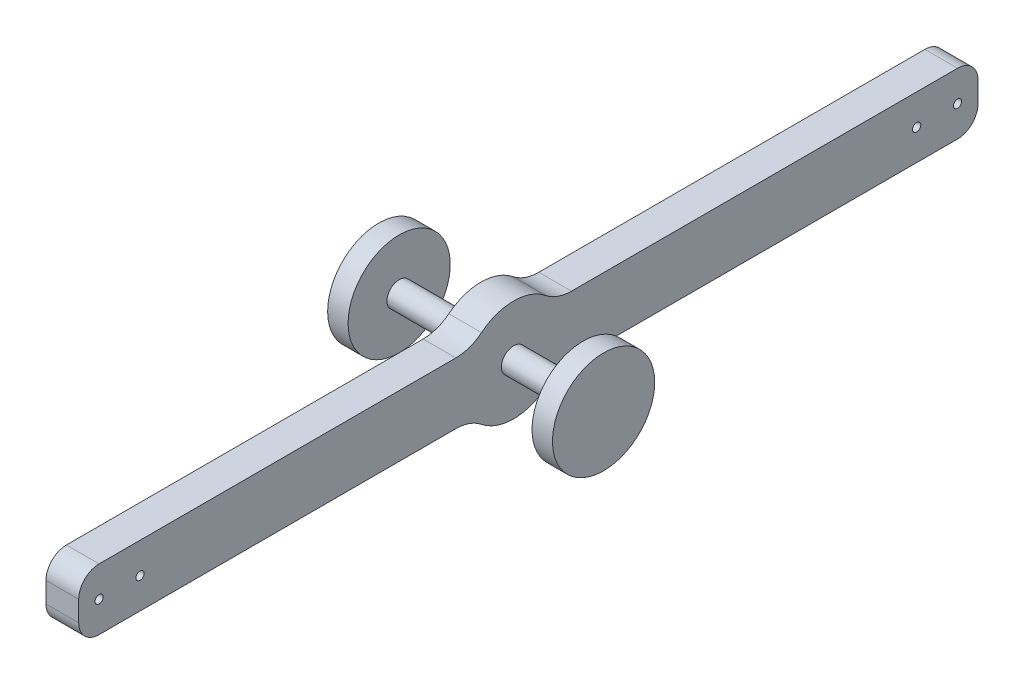
ISO-10303-21;
HEADER;
FILE_DESCRIPTION(('STEP AP214'),'2;1');
FILE_NAME('part.step','',(''),(''),'','','');
FILE_SCHEMA(('AUTOMOTIVE_DESIGN { 1 0 10303 214 1 1 1 1 }'));
ENDSEC;
DATA;
#1=APPLICATION_CONTEXT('core data for automotive mechanical design processes');
#2=APPLICATION_PROTOCOL_DEFINITION('international standard','automotive_design',2000,#1);
#3=PRODUCT_CONTEXT('',#1,'mechanical');
#4=PRODUCT('Part','Part','',(#3));
#5=PRODUCT_RELATED_PRODUCT_CATEGORY('part','',(#4));
#6=PRODUCT_DEFINITION_FORMATION('','',#4);
#7=PRODUCT_DEFINITION_CONTEXT('part definition',#1,'design');
#8=PRODUCT_DEFINITION('design','',#6,#7);
#9=PRODUCT_DEFINITION_SHAPE('','',#8);
#10=(LENGTH_UNIT() NAMED_UNIT(*) SI_UNIT(.MILLI.,.METRE.));
#11=(NAMED_UNIT(*) PLANE_ANGLE_UNIT() SI_UNIT($,.RADIAN.));
#12=(NAMED_UNIT(*) SI_UNIT($,.STERADIAN.) SOLID_ANGLE_UNIT());
#13=UNCERTAINTY_MEASURE_WITH_UNIT(LENGTH_MEASURE(1.E-05),#10,'distance_accuracy_value','');
#14=(GEOMETRIC_REPRESENTATION_CONTEXT(3) GLOBAL_UNCERTAINTY_ASSIGNED_CONTEXT((#13)) GLOBAL_UNIT_ASSIGNED_CONTEXT((#10,
#11,#12)) REPRESENTATION_CONTEXT('',''));
#15=CARTESIAN_POINT('',(0.,0.,0.));
#16=DIRECTION('',(0.,0.,1.));
#17=DIRECTION('',(1.,0.,0.));
#18=AXIS2_PLACEMENT_3D('',#15,#16,#17);
#19=CARTESIAN_POINT('',(-35.3553390593274,7.5,-6.4));
#20=DIRECTION('',(1.,0.,0.));
#21=DIRECTION('',(0.,0.,-1.));
#22=AXIS2_PLACEMENT_3D('',#19,#20,#21);
#23=CYLINDRICAL_SURFACE('',#22,12.5);
#24=CARTESIAN_POINT('',(0.,7.5,-6.4));
#25=DIRECTION('',(-1.,0.,0.));
#26=DIRECTION('',(0.,0.,1.));
#27=AXIS2_PLACEMENT_3D('',#24,#25,#26);
#28=CIRCLE('',#27,12.5);
#29=CARTESIAN_POINT('',(0.,-2.22222222222222,1.45674201318386));
#30=VERTEX_POINT('',#29);
#31=CARTESIAN_POINT('',(0.,-2.22222222222222,-14.2567420131839));
#32=VERTEX_POINT('',#31);
#33=EDGE_CURVE('E289',#30,#32,#28,.F.);
#34=ORIENTED_EDGE('',*,*,#33,.T.);
#35=DIRECTION('',(1.,0.,0.));
#36=VECTOR('',#35,1.);
#37=CARTESIAN_POINT('',(-35.3553390593274,-2.22222222222222,-14.2567420131839));
#38=LINE('',#37,#36);
#39=CARTESIAN_POINT('',(8.,-2.22222222222222,-14.2567420131839));
#40=VERTEX_POINT('',#39);
#41=EDGE_CURVE('E210',#32,#40,#38,.T.);
#42=ORIENTED_EDGE('',*,*,#41,.T.);
#43=CARTESIAN_POINT('',(8.,7.5,-6.4));
#44=DIRECTION('',(1.,0.,0.));
#45=DIRECTION('',(0.,0.,-1.));
#46=AXIS2_PLACEMENT_3D('',#43,#44,#45);
#47=CIRCLE('',#46,12.5);
#48=CARTESIAN_POINT('',(8.,-2.22222222222222,1.45674201318386));
#49=VERTEX_POINT('',#48);
#50=EDGE_CURVE('E285',#49,#40,#47,.T.);
#51=ORIENTED_EDGE('',*,*,#50,.F.);
#52=DIRECTION('',(1.,0.,0.));
#53=VECTOR('',#52,1.);
#54=CARTESIAN_POINT('',(-35.3553390593274,-2.22222222222222,1.45674201318386));
#55=LINE('',#54,#53);
#56=EDGE_CURVE('E207',#49,#30,#55,.F.);
#57=ORIENTED_EDGE('',*,*,#56,.T.);
#58=EDGE_LOOP('',(#34,#42,#51,#57));
#59=FACE_BOUND('',#58,.T.);
#60=ADVANCED_FACE('F37',(#59),#23,.T.);
#61=CARTESIAN_POINT('',(8.,17.2222222222222,-14.2567420131839));
#62=VERTEX_POINT('',#61);
#63=CARTESIAN_POINT('',(8.,17.2222222222222,1.45674201318386));
#64=VERTEX_POINT('',#63);
#65=EDGE_CURVE('E288',#62,#64,#47,.T.);
#66=ORIENTED_EDGE('',*,*,#65,.F.);
#67=DIRECTION('',(1.,0.,0.));
#68=VECTOR('',#67,1.);
#69=CARTESIAN_POINT('',(-35.3553390593274,17.2222222222222,-14.2567420131839));
#70=LINE('',#69,#68);
#71=CARTESIAN_POINT('',(0.,17.2222222222222,-14.2567420131839));
#72=VERTEX_POINT('',#71);
#73=EDGE_CURVE('E202',#62,#72,#70,.F.);
#74=ORIENTED_EDGE('',*,*,#73,.T.);
#75=CARTESIAN_POINT('',(0.,17.2222222222222,1.45674201318386));
#76=VERTEX_POINT('',#75);
#77=EDGE_CURVE('E181',#72,#76,#28,.F.);
#78=ORIENTED_EDGE('',*,*,#77,.T.);
#79=DIRECTION('',(1.,0.,0.));
#80=VECTOR('',#79,1.);
#81=CARTESIAN_POINT('',(-35.3553390593274,17.2222222222222,1.45674201318386));
#82=LINE('',#81,#80);
#83=EDGE_CURVE('E199',#76,#64,#82,.T.);
#84=ORIENTED_EDGE('',*,*,#83,.T.);
#85=EDGE_LOOP('',(#66,#74,#78,#84));
#86=FACE_BOUND('',#85,.T.);
#87=ADVANCED_FACE('F329',(#86),#23,.T.);
#88=CARTESIAN_POINT('',(8.,0.,0.));
#89=DIRECTION('',(0.,1.,0.));
#90=DIRECTION('',(0.,0.,1.));
#91=AXIS2_PLACEMENT_3D('',#88,#89,#90);
#92=PLANE('',#91);
#93=DIRECTION('',(0.,0.,-1.));
#94=VECTOR('',#93,1.);
#95=CARTESIAN_POINT('',(8.,0.,0.));
#96=LINE('',#95,#94);
#97=CARTESIAN_POINT('',(8.,0.,-20.5421356237309));
#98=VERTEX_POINT('',#97);
#99=CARTESIAN_POINT('',(8.,0.,-115.));
#100=VERTEX_POINT('',#99);
#101=EDGE_CURVE('E179',#98,#100,#96,.T.);
#102=ORIENTED_EDGE('',*,*,#101,.F.);
#103=DIRECTION('',(1.,0.,0.));
#104=VECTOR('',#103,1.);
#105=CARTESIAN_POINT('',(8.,0.,-20.5421356237309));
#106=LINE('',#105,#104);
#107=CARTESIAN_POINT('',(0.,0.,-20.5421356237309));
#108=VERTEX_POINT('',#107);
#109=EDGE_CURVE('E204',#98,#108,#106,.F.);
#110=ORIENTED_EDGE('',*,*,#109,.T.);
#111=DIRECTION('',(0.,0.,-1.));
#112=VECTOR('',#111,1.);
#113=CARTESIAN_POINT('',(0.,0.,0.));
#114=LINE('',#113,#112);
#115=CARTESIAN_POINT('',(0.,0.,-115.));
#116=VERTEX_POINT('',#115);
#117=EDGE_CURVE('E176',#108,#116,#114,.T.);
#118=ORIENTED_EDGE('',*,*,#117,.T.);
#119=DIRECTION('',(-1.,0.,0.));
#120=VECTOR('',#119,1.);
#121=CARTESIAN_POINT('',(8.,0.,-115.));
#122=LINE('',#121,#120);
#123=EDGE_CURVE('E158',#116,#100,#122,.F.);
#124=ORIENTED_EDGE('',*,*,#123,.T.);
#125=EDGE_LOOP('',(#102,#110,#118,#124));
#126=FACE_BOUND('',#125,.T.);
#127=ADVANCED_FACE('F307',(#126),#92,.F.);
#128=CARTESIAN_POINT('',(8.,0.,-120.));
#129=DIRECTION('',(0.,0.,1.));
#130=DIRECTION('',(1.,0.,0.));
#131=AXIS2_PLACEMENT_3D('',#128,#129,#130);
#132=PLANE('',#131);
#133=DIRECTION('',(0.,1.,0.));
#134=VECTOR('',#133,1.);
#135=CARTESIAN_POINT('',(8.,0.,-120.));
#136=LINE('',#135,#134);
#137=CARTESIAN_POINT('',(8.,5.,-120.));
#138=VERTEX_POINT('',#137);
#139=CARTESIAN_POINT('',(8.,10.,-120.));
#140=VERTEX_POINT('',#139);
#141=EDGE_CURVE('E170',#138,#140,#136,.T.);
#142=ORIENTED_EDGE('',*,*,#141,.F.);
#143=DIRECTION('',(-1.,0.,0.));
#144=VECTOR('',#143,1.);
#145=CARTESIAN_POINT('',(8.,5.,-120.));
#146=LINE('',#145,#144);
#147=CARTESIAN_POINT('',(0.,5.,-120.));
#148=VERTEX_POINT('',#147);
#149=EDGE_CURVE('E156',#138,#148,#146,.T.);
#150=ORIENTED_EDGE('',*,*,#149,.T.);
#151=DIRECTION('',(0.,1.,0.));
#152=VECTOR('',#151,1.);
#153=CARTESIAN_POINT('',(0.,0.,-120.));
#154=LINE('',#153,#152);
#155=CARTESIAN_POINT('',(0.,10.,-120.));
#156=VERTEX_POINT('',#155);
#157=EDGE_CURVE('E167',#148,#156,#154,.T.);
#158=ORIENTED_EDGE('',*,*,#157,.T.);
#159=DIRECTION('',(-1.,0.,0.));
#160=VECTOR('',#159,1.);
#161=CARTESIAN_POINT('',(8.,10.,-120.));
#162=LINE('',#161,#160);
#163=EDGE_CURVE('E171',#156,#140,#162,.F.);
#164=ORIENTED_EDGE('',*,*,#163,.T.);
#165=EDGE_LOOP('',(#142,#150,#158,#164));
#166=FACE_BOUND('',#165,.T.);
#167=ADVANCED_FACE('F166',(#166),#132,.F.);
#168=CARTESIAN_POINT('',(8.,15.,0.));
#169=DIRECTION('',(0.,-1.,0.));
#170=DIRECTION('',(0.,0.,-1.));
#171=AXIS2_PLACEMENT_3D('',#168,#169,#170);
#172=PLANE('',#171);
#173=DIRECTION('',(0.,0.,1.));
#174=VECTOR('',#173,1.);
#175=CARTESIAN_POINT('',(0.,15.,0.));
#176=LINE('',#175,#174);
#177=CARTESIAN_POINT('',(0.,15.,-115.));
#178=VERTEX_POINT('',#177);
#179=CARTESIAN_POINT('',(0.,15.,-20.5421356237309));
#180=VERTEX_POINT('',#179);
#181=EDGE_CURVE('E175',#178,#180,#176,.T.);
#182=ORIENTED_EDGE('',*,*,#181,.T.);
#183=DIRECTION('',(1.,0.,0.));
#184=VECTOR('',#183,1.);
#185=CARTESIAN_POINT('',(8.,15.,-20.5421356237309));
#186=LINE('',#185,#184);
#187=CARTESIAN_POINT('',(8.,15.,-20.5421356237309));
#188=VERTEX_POINT('',#187);
#189=EDGE_CURVE('E196',#180,#188,#186,.T.);
#190=ORIENTED_EDGE('',*,*,#189,.T.);
#191=DIRECTION('',(0.,0.,1.));
#192=VECTOR('',#191,1.);
#193=CARTESIAN_POINT('',(8.,15.,0.));
#194=LINE('',#193,#192);
#195=CARTESIAN_POINT('',(8.,15.,-115.));
#196=VERTEX_POINT('',#195);
#197=EDGE_CURVE('E185',#196,#188,#194,.T.);
#198=ORIENTED_EDGE('',*,*,#197,.F.);
#199=DIRECTION('',(-1.,0.,0.));
#200=VECTOR('',#199,1.);
#201=CARTESIAN_POINT('',(8.,15.,-115.));
#202=LINE('',#201,#200);
#203=EDGE_CURVE('E193',#196,#178,#202,.T.);
#204=ORIENTED_EDGE('',*,*,#203,.T.);
#205=EDGE_LOOP('',(#182,#190,#198,#204));
#206=FACE_BOUND('',#205,.T.);
#207=ADVANCED_FACE('F299',(#206),#172,.F.);
#208=CARTESIAN_POINT('',(8.,0.,0.));
#209=DIRECTION('',(-1.,0.,0.));
#210=DIRECTION('',(0.,0.,1.));
#211=AXIS2_PLACEMENT_3D('',#208,#209,#210);
#212=PLANE('',#211);
#213=CARTESIAN_POINT('',(8.,7.5,-6.4));
#214=DIRECTION('',(-1.,0.,0.));
#215=DIRECTION('',(0.,0.,1.));
#216=AXIS2_PLACEMENT_3D('',#213,#214,#215);
#217=CIRCLE('',#216,3.);
#218=CARTESIAN_POINT('',(8.,7.5,-3.4));
#219=VERTEX_POINT('',#218);
#220=EDGE_CURVE('E579',#219,#219,#217,.T.);
#221=ORIENTED_EDGE('',*,*,#220,.T.);
#222=EDGE_LOOP('',(#221));
#223=FACE_BOUND('',#222,.T.);
#224=CARTESIAN_POINT('',(8.,7.5,-115.));
#225=DIRECTION('',(-1.,0.,0.));
#226=DIRECTION('',(0.,0.,1.));
#227=AXIS2_PLACEMENT_3D('',#224,#225,#226);
#228=CIRCLE('',#227,0.999999999999998);
#229=CARTESIAN_POINT('',(8.,7.5,-114.));
#230=VERTEX_POINT('',#229);
#231=EDGE_CURVE('E273',#230,#230,#228,.T.);
#232=ORIENTED_EDGE('',*,*,#231,.T.);
#233=EDGE_LOOP('',(#232));
#234=FACE_BOUND('',#233,.T.);
#235=CARTESIAN_POINT('',(8.,7.5,-105.));
#236=DIRECTION('',(-1.,0.,0.));
#237=DIRECTION('',(0.,0.,1.));
#238=AXIS2_PLACEMENT_3D('',#235,#236,#237);
#239=CIRCLE('',#238,0.999999999999998);
#240=CARTESIAN_POINT('',(8.,7.5,-104.));
#241=VERTEX_POINT('',#240);
#242=EDGE_CURVE('E277',#241,#241,#239,.T.);
#243=ORIENTED_EDGE('',*,*,#242,.T.);
#244=EDGE_LOOP('',(#243));
#245=FACE_BOUND('',#244,.T.);
#246=CARTESIAN_POINT('',(8.,7.5,85.));
#247=DIRECTION('',(-1.,0.,0.));
#248=DIRECTION('',(0.,0.,1.));
#249=AXIS2_PLACEMENT_3D('',#246,#247,#248);
#250=CIRCLE('',#249,0.999999999999998);
#251=CARTESIAN_POINT('',(8.,7.5,86.));
#252=VERTEX_POINT('',#251);
#253=EDGE_CURVE('E598',#252,#252,#250,.T.);
#254=ORIENTED_EDGE('',*,*,#253,.T.);
#255=EDGE_LOOP('',(#254));
#256=FACE_BOUND('',#255,.T.);
#257=CARTESIAN_POINT('',(8.,7.5,95.));
#258=DIRECTION('',(-1.,0.,0.));
#259=DIRECTION('',(0.,0.,1.));
#260=AXIS2_PLACEMENT_3D('',#257,#258,#259);
#261=CIRCLE('',#260,0.999999999999998);
#262=CARTESIAN_POINT('',(8.,7.5,96.));
#263=VERTEX_POINT('',#262);
#264=EDGE_CURVE('E587',#263,#263,#261,.T.);
#265=ORIENTED_EDGE('',*,*,#264,.T.);
#266=EDGE_LOOP('',(#265));
#267=FACE_BOUND('',#266,.T.);
#268=DIRECTION('',(0.,1.,0.));
#269=VECTOR('',#268,1.);
#270=CARTESIAN_POINT('',(8.,15.,100.));
#271=LINE('',#270,#269);
#272=CARTESIAN_POINT('',(8.,5.,100.));
#273=VERTEX_POINT('',#272);
#274=CARTESIAN_POINT('',(8.,10.,100.));
#275=VERTEX_POINT('',#274);
#276=EDGE_CURVE('E271',#273,#275,#271,.T.);
#277=ORIENTED_EDGE('',*,*,#276,.F.);
#278=CARTESIAN_POINT('',(8.,5.,95.));
#279=DIRECTION('',(-1.,0.,0.));
#280=DIRECTION('',(0.,0.,1.));
#281=AXIS2_PLACEMENT_3D('',#278,#279,#280);
#282=CIRCLE('',#281,5.);
#283=CARTESIAN_POINT('',(8.,0.,95.));
#284=VERTEX_POINT('',#283);
#285=EDGE_CURVE('E244',#273,#284,#282,.F.);
#286=ORIENTED_EDGE('',*,*,#285,.T.);
#287=DIRECTION('',(0.,0.,-1.));
#288=VECTOR('',#287,1.);
#289=CARTESIAN_POINT('',(8.,0.,100.));
#290=LINE('',#289,#288);
#291=CARTESIAN_POINT('',(8.,0.,7.74213562373094));
#292=VERTEX_POINT('',#291);
#293=EDGE_CURVE('E263',#284,#292,#290,.T.);
#294=ORIENTED_EDGE('',*,*,#293,.T.);
#295=CARTESIAN_POINT('',(8.,-10.,7.74213562373095));
#296=DIRECTION('',(-1.,0.,0.));
#297=DIRECTION('',(0.,0.,1.));
#298=AXIS2_PLACEMENT_3D('',#295,#296,#297);
#299=CIRCLE('',#298,10.);
#300=EDGE_CURVE('E229',#292,#49,#299,.T.);
#301=ORIENTED_EDGE('',*,*,#300,.T.);
#302=ORIENTED_EDGE('',*,*,#50,.T.);
#303=CARTESIAN_POINT('',(8.,-10.,-20.5421356237309));
#304=DIRECTION('',(-1.,0.,0.));
#305=DIRECTION('',(0.,0.,1.));
#306=AXIS2_PLACEMENT_3D('',#303,#304,#305);
#307=CIRCLE('',#306,10.);
#308=EDGE_CURVE('E224',#40,#98,#307,.T.);
#309=ORIENTED_EDGE('',*,*,#308,.T.);
#310=ORIENTED_EDGE('',*,*,#101,.T.);
#311=CARTESIAN_POINT('',(8.,5.,-115.));
#312=DIRECTION('',(-1.,0.,0.));
#313=DIRECTION('',(0.,0.,1.));
#314=AXIS2_PLACEMENT_3D('',#311,#312,#313);
#315=CIRCLE('',#314,5.);
#316=EDGE_CURVE('E191',#100,#138,#315,.F.);
#317=ORIENTED_EDGE('',*,*,#316,.T.);
#318=ORIENTED_EDGE('',*,*,#141,.T.);
#319=CARTESIAN_POINT('',(8.,10.,-115.));
#320=DIRECTION('',(-1.,0.,0.));
#321=DIRECTION('',(0.,0.,1.));
#322=AXIS2_PLACEMENT_3D('',#319,#320,#321);
#323=CIRCLE('',#322,5.);
#324=EDGE_CURVE('E189',#140,#196,#323,.F.);
#325=ORIENTED_EDGE('',*,*,#324,.T.);
#326=ORIENTED_EDGE('',*,*,#197,.T.);
#327=CARTESIAN_POINT('',(8.,25.,-20.5421356237309));
#328=DIRECTION('',(-1.,0.,0.));
#329=DIRECTION('',(0.,0.,1.));
#330=AXIS2_PLACEMENT_3D('',#327,#328,#329);
#331=CIRCLE('',#330,10.);
#332=EDGE_CURVE('E218',#188,#62,#331,.T.);
#333=ORIENTED_EDGE('',*,*,#332,.T.);
#334=ORIENTED_EDGE('',*,*,#65,.T.);
#335=CARTESIAN_POINT('',(8.,25.,7.74213562373095));
#336=DIRECTION('',(-1.,0.,0.));
#337=DIRECTION('',(0.,0.,1.));
#338=AXIS2_PLACEMENT_3D('',#335,#336,#337);
#339=CIRCLE('',#338,10.);
#340=CARTESIAN_POINT('',(8.,15.,7.74213562373094));
#341=VERTEX_POINT('',#340);
#342=EDGE_CURVE('E231',#64,#341,#339,.T.);
#343=ORIENTED_EDGE('',*,*,#342,.T.);
#344=DIRECTION('',(0.,0.,-1.));
#345=VECTOR('',#344,1.);
#346=CARTESIAN_POINT('',(8.,15.,100.));
#347=LINE('',#346,#345);
#348=CARTESIAN_POINT('',(8.,15.,95.));
#349=VERTEX_POINT('',#348);
#350=EDGE_CURVE('E253',#349,#341,#347,.T.);
#351=ORIENTED_EDGE('',*,*,#350,.F.);
#352=CARTESIAN_POINT('',(8.,10.,95.));
#353=DIRECTION('',(-1.,0.,0.));
#354=DIRECTION('',(0.,0.,1.));
#355=AXIS2_PLACEMENT_3D('',#352,#353,#354);
#356=CIRCLE('',#355,5.);
#357=EDGE_CURVE('E242',#349,#275,#356,.F.);
#358=ORIENTED_EDGE('',*,*,#357,.T.);
#359=EDGE_LOOP('',(#277,#286,#294,#301,#302,#309,#310,#317,#318,#325,#326,#333,#334,#343,#351,#358));
#360=FACE_BOUND('',#359,.T.);
#361=ADVANCED_FACE('F259',(#223,#234,#245,#256,#267,#360),#212,.F.);
#362=CARTESIAN_POINT('',(0.,0.,0.));
#363=DIRECTION('',(-1.,0.,0.));
#364=DIRECTION('',(0.,0.,1.));
#365=AXIS2_PLACEMENT_3D('',#362,#363,#364);
#366=PLANE('',#365);
#367=CARTESIAN_POINT('',(0.,7.5,-6.4));
#368=DIRECTION('',(-1.,0.,0.));
#369=DIRECTION('',(0.,0.,1.));
#370=AXIS2_PLACEMENT_3D('',#367,#368,#369);
#371=CIRCLE('',#370,3.);
#372=CARTESIAN_POINT('',(0.,7.5,-3.4));
#373=VERTEX_POINT('',#372);
#374=EDGE_CURVE('E11',#373,#373,#371,.T.);
#375=ORIENTED_EDGE('',*,*,#374,.F.);
#376=EDGE_LOOP('',(#375));
#377=FACE_BOUND('',#376,.T.);
#378=CARTESIAN_POINT('',(0.,7.5,-115.));
#379=DIRECTION('',(-1.,0.,0.));
#380=DIRECTION('',(0.,0.,1.));
#381=AXIS2_PLACEMENT_3D('',#378,#379,#380);
#382=CIRCLE('',#381,0.999999999999998);
#383=CARTESIAN_POINT('',(0.,7.5,-114.));
#384=VERTEX_POINT('',#383);
#385=EDGE_CURVE('E584',#384,#384,#382,.T.);
#386=ORIENTED_EDGE('',*,*,#385,.F.);
#387=EDGE_LOOP('',(#386));
#388=FACE_BOUND('',#387,.T.);
#389=CARTESIAN_POINT('',(0.,7.5,-105.));
#390=DIRECTION('',(-1.,0.,0.));
#391=DIRECTION('',(0.,0.,1.));
#392=AXIS2_PLACEMENT_3D('',#389,#390,#391);
#393=CIRCLE('',#392,0.999999999999998);
#394=CARTESIAN_POINT('',(0.,7.5,-104.));
#395=VERTEX_POINT('',#394);
#396=EDGE_CURVE('E588',#395,#395,#393,.T.);
#397=ORIENTED_EDGE('',*,*,#396,.F.);
#398=EDGE_LOOP('',(#397));
#399=FACE_BOUND('',#398,.T.);
#400=CARTESIAN_POINT('',(0.,7.5,85.));
#401=DIRECTION('',(-1.,0.,0.));
#402=DIRECTION('',(0.,0.,1.));
#403=AXIS2_PLACEMENT_3D('',#400,#401,#402);
#404=CIRCLE('',#403,0.999999999999998);
#405=CARTESIAN_POINT('',(0.,7.5,86.));
#406=VERTEX_POINT('',#405);
#407=EDGE_CURVE('E591',#406,#406,#404,.T.);
#408=ORIENTED_EDGE('',*,*,#407,.F.);
#409=EDGE_LOOP('',(#408));
#410=FACE_BOUND('',#409,.T.);
#411=CARTESIAN_POINT('',(0.,7.5,95.));
#412=DIRECTION('',(-1.,0.,0.));
#413=DIRECTION('',(0.,0.,1.));
#414=AXIS2_PLACEMENT_3D('',#411,#412,#413);
#415=CIRCLE('',#414,0.999999999999998);
#416=CARTESIAN_POINT('',(0.,7.5,96.));
#417=VERTEX_POINT('',#416);
#418=EDGE_CURVE('E583',#417,#417,#415,.T.);
#419=ORIENTED_EDGE('',*,*,#418,.F.);
#420=EDGE_LOOP('',(#419));
#421=FACE_BOUND('',#420,.T.);
#422=DIRECTION('',(0.,0.,-1.));
#423=VECTOR('',#422,1.);
#424=CARTESIAN_POINT('',(0.,0.,100.));
#425=LINE('',#424,#423);
#426=CARTESIAN_POINT('',(0.,0.,95.));
#427=VERTEX_POINT('',#426);
#428=CARTESIAN_POINT('',(0.,0.,7.74213562373094));
#429=VERTEX_POINT('',#428);
#430=EDGE_CURVE('E283',#427,#429,#425,.T.);
#431=ORIENTED_EDGE('',*,*,#430,.F.);
#432=CARTESIAN_POINT('',(0.,5.,95.));
#433=DIRECTION('',(-1.,0.,0.));
#434=DIRECTION('',(0.,0.,1.));
#435=AXIS2_PLACEMENT_3D('',#432,#433,#434);
#436=CIRCLE('',#435,5.);
#437=CARTESIAN_POINT('',(0.,5.,100.));
#438=VERTEX_POINT('',#437);
#439=EDGE_CURVE('E248',#427,#438,#436,.T.);
#440=ORIENTED_EDGE('',*,*,#439,.T.);
#441=DIRECTION('',(0.,-1.,0.));
#442=VECTOR('',#441,1.);
#443=CARTESIAN_POINT('',(0.,15.,100.));
#444=LINE('',#443,#442);
#445=CARTESIAN_POINT('',(0.,10.,100.));
#446=VERTEX_POINT('',#445);
#447=EDGE_CURVE('E269',#446,#438,#444,.T.);
#448=ORIENTED_EDGE('',*,*,#447,.F.);
#449=CARTESIAN_POINT('',(0.,10.,95.));
#450=DIRECTION('',(-1.,0.,0.));
#451=DIRECTION('',(0.,0.,1.));
#452=AXIS2_PLACEMENT_3D('',#449,#450,#451);
#453=CIRCLE('',#452,5.);
#454=CARTESIAN_POINT('',(0.,15.,95.));
#455=VERTEX_POINT('',#454);
#456=EDGE_CURVE('E52',#446,#455,#453,.T.);
#457=ORIENTED_EDGE('',*,*,#456,.T.);
#458=DIRECTION('',(0.,0.,-1.));
#459=VECTOR('',#458,1.);
#460=CARTESIAN_POINT('',(0.,15.,100.));
#461=LINE('',#460,#459);
#462=CARTESIAN_POINT('',(0.,15.,7.74213562373094));
#463=VERTEX_POINT('',#462);
#464=EDGE_CURVE('E254',#455,#463,#461,.T.);
#465=ORIENTED_EDGE('',*,*,#464,.T.);
#466=CARTESIAN_POINT('',(0.,25.,7.74213562373095));
#467=DIRECTION('',(-1.,0.,0.));
#468=DIRECTION('',(0.,0.,1.));
#469=AXIS2_PLACEMENT_3D('',#466,#467,#468);
#470=CIRCLE('',#469,10.);
#471=EDGE_CURVE('E234',#463,#76,#470,.F.);
#472=ORIENTED_EDGE('',*,*,#471,.T.);
#473=ORIENTED_EDGE('',*,*,#77,.F.);
#474=CARTESIAN_POINT('',(0.,25.,-20.5421356237309));
#475=DIRECTION('',(-1.,0.,0.));
#476=DIRECTION('',(0.,0.,1.));
#477=AXIS2_PLACEMENT_3D('',#474,#475,#476);
#478=CIRCLE('',#477,10.);
#479=EDGE_CURVE('E220',#72,#180,#478,.F.);
#480=ORIENTED_EDGE('',*,*,#479,.T.);
#481=ORIENTED_EDGE('',*,*,#181,.F.);
#482=CARTESIAN_POINT('',(0.,10.,-115.));
#483=DIRECTION('',(-1.,0.,0.));
#484=DIRECTION('',(0.,0.,1.));
#485=AXIS2_PLACEMENT_3D('',#482,#483,#484);
#486=CIRCLE('',#485,5.);
#487=EDGE_CURVE('E161',#178,#156,#486,.T.);
#488=ORIENTED_EDGE('',*,*,#487,.T.);
#489=ORIENTED_EDGE('',*,*,#157,.F.);
#490=CARTESIAN_POINT('',(0.,5.,-115.));
#491=DIRECTION('',(-1.,0.,0.));
#492=DIRECTION('',(0.,0.,1.));
#493=AXIS2_PLACEMENT_3D('',#490,#491,#492);
#494=CIRCLE('',#493,5.);
#495=EDGE_CURVE('E152',#148,#116,#494,.T.);
#496=ORIENTED_EDGE('',*,*,#495,.T.);
#497=ORIENTED_EDGE('',*,*,#117,.F.);
#498=CARTESIAN_POINT('',(0.,-10.,-20.5421356237309));
#499=DIRECTION('',(-1.,0.,0.));
#500=DIRECTION('',(0.,0.,1.));
#501=AXIS2_PLACEMENT_3D('',#498,#499,#500);
#502=CIRCLE('',#501,10.);
#503=EDGE_CURVE('E222',#108,#32,#502,.F.);
#504=ORIENTED_EDGE('',*,*,#503,.T.);
#505=ORIENTED_EDGE('',*,*,#33,.F.);
#506=CARTESIAN_POINT('',(0.,-10.,7.74213562373095));
#507=DIRECTION('',(-1.,0.,0.));
#508=DIRECTION('',(0.,0.,1.));
#509=AXIS2_PLACEMENT_3D('',#506,#507,#508);
#510=CIRCLE('',#509,10.);
#511=EDGE_CURVE('E226',#30,#429,#510,.F.);
#512=ORIENTED_EDGE('',*,*,#511,.T.);
#513=EDGE_LOOP('',(#431,#440,#448,#457,#465,#472,#473,#480,#481,#488,#489,#496,#497,#504,#505,#512));
#514=FACE_BOUND('',#513,.T.);
#515=ADVANCED_FACE('F173',(#377,#388,#399,#410,#421,#514),#366,.T.);
#516=CARTESIAN_POINT('',(8.,5.,-115.));
#517=DIRECTION('',(-1.,0.,0.));
#518=DIRECTION('',(0.,0.,1.));
#519=AXIS2_PLACEMENT_3D('',#516,#517,#518);
#520=CYLINDRICAL_SURFACE('',#519,5.);
#521=ORIENTED_EDGE('',*,*,#316,.F.);
#522=ORIENTED_EDGE('',*,*,#123,.F.);
#523=ORIENTED_EDGE('',*,*,#495,.F.);
#524=ORIENTED_EDGE('',*,*,#149,.F.);
#525=EDGE_LOOP('',(#521,#522,#523,#524));
#526=FACE_BOUND('',#525,.T.);
#527=ADVANCED_FACE('F155',(#526),#520,.T.);
#528=CARTESIAN_POINT('',(8.,10.,-115.));
#529=DIRECTION('',(-1.,0.,0.));
#530=DIRECTION('',(0.,0.,1.));
#531=AXIS2_PLACEMENT_3D('',#528,#529,#530);
#532=CYLINDRICAL_SURFACE('',#531,5.);
#533=ORIENTED_EDGE('',*,*,#324,.F.);
#534=ORIENTED_EDGE('',*,*,#163,.F.);
#535=ORIENTED_EDGE('',*,*,#487,.F.);
#536=ORIENTED_EDGE('',*,*,#203,.F.);
#537=EDGE_LOOP('',(#533,#534,#535,#536));
#538=FACE_BOUND('',#537,.T.);
#539=ADVANCED_FACE('F302',(#538),#532,.T.);
#540=CARTESIAN_POINT('',(0.,0.,100.));
#541=DIRECTION('',(0.,1.,0.));
#542=DIRECTION('',(0.,0.,1.));
#543=AXIS2_PLACEMENT_3D('',#540,#541,#542);
#544=PLANE('',#543);
#545=ORIENTED_EDGE('',*,*,#293,.F.);
#546=DIRECTION('',(1.,0.,0.));
#547=VECTOR('',#546,1.);
#548=CARTESIAN_POINT('',(0.,0.,95.));
#549=LINE('',#548,#547);
#550=EDGE_CURVE('E60',#284,#427,#549,.F.);
#551=ORIENTED_EDGE('',*,*,#550,.T.);
#552=ORIENTED_EDGE('',*,*,#430,.T.);
#553=DIRECTION('',(1.,0.,0.));
#554=VECTOR('',#553,1.);
#555=CARTESIAN_POINT('',(0.,0.,7.74213562373094));
#556=LINE('',#555,#554);
#557=EDGE_CURVE('E212',#429,#292,#556,.T.);
#558=ORIENTED_EDGE('',*,*,#557,.T.);
#559=EDGE_LOOP('',(#545,#551,#552,#558));
#560=FACE_BOUND('',#559,.T.);
#561=ADVANCED_FACE('F337',(#560),#544,.F.);
#562=CARTESIAN_POINT('',(0.,15.,100.));
#563=DIRECTION('',(0.,-1.,0.));
#564=DIRECTION('',(0.,0.,-1.));
#565=AXIS2_PLACEMENT_3D('',#562,#563,#564);
#566=PLANE('',#565);
#567=ORIENTED_EDGE('',*,*,#464,.F.);
#568=DIRECTION('',(-1.,0.,0.));
#569=VECTOR('',#568,1.);
#570=CARTESIAN_POINT('',(8.,15.,95.));
#571=LINE('',#570,#569);
#572=EDGE_CURVE('E45',#455,#349,#571,.F.);
#573=ORIENTED_EDGE('',*,*,#572,.T.);
#574=ORIENTED_EDGE('',*,*,#350,.T.);
#575=DIRECTION('',(1.,0.,0.));
#576=VECTOR('',#575,1.);
#577=CARTESIAN_POINT('',(0.,15.,7.74213562373094));
#578=LINE('',#577,#576);
#579=EDGE_CURVE('E215',#341,#463,#578,.F.);
#580=ORIENTED_EDGE('',*,*,#579,.T.);
#581=EDGE_LOOP('',(#567,#573,#574,#580));
#582=FACE_BOUND('',#581,.T.);
#583=ADVANCED_FACE('F252',(#582),#566,.F.);
#584=CARTESIAN_POINT('',(0.,0.,100.));
#585=DIRECTION('',(0.,0.,1.));
#586=DIRECTION('',(1.,0.,0.));
#587=AXIS2_PLACEMENT_3D('',#584,#585,#586);
#588=PLANE('',#587);
#589=ORIENTED_EDGE('',*,*,#447,.T.);
#590=DIRECTION('',(1.,0.,0.));
#591=VECTOR('',#590,1.);
#592=CARTESIAN_POINT('',(8.,5.,100.));
#593=LINE('',#592,#591);
#594=EDGE_CURVE('E239',#438,#273,#593,.T.);
#595=ORIENTED_EDGE('',*,*,#594,.T.);
#596=ORIENTED_EDGE('',*,*,#276,.T.);
#597=DIRECTION('',(-1.,0.,0.));
#598=VECTOR('',#597,1.);
#599=CARTESIAN_POINT('',(0.,10.,100.));
#600=LINE('',#599,#598);
#601=EDGE_CURVE('E236',#275,#446,#600,.T.);
#602=ORIENTED_EDGE('',*,*,#601,.T.);
#603=EDGE_LOOP('',(#589,#595,#596,#602));
#604=FACE_BOUND('',#603,.T.);
#605=ADVANCED_FACE('F268',(#604),#588,.T.);
#606=CARTESIAN_POINT('',(-35.3553390593274,25.,-20.5421356237309));
#607=DIRECTION('',(1.,0.,0.));
#608=DIRECTION('',(0.,0.,-1.));
#609=AXIS2_PLACEMENT_3D('',#606,#607,#608);
#610=CYLINDRICAL_SURFACE('',#609,10.);
#611=ORIENTED_EDGE('',*,*,#479,.F.);
#612=ORIENTED_EDGE('',*,*,#73,.F.);
#613=ORIENTED_EDGE('',*,*,#332,.F.);
#614=ORIENTED_EDGE('',*,*,#189,.F.);
#615=EDGE_LOOP('',(#611,#612,#613,#614));
#616=FACE_BOUND('',#615,.T.);
#617=ADVANCED_FACE('F317',(#616),#610,.F.);
#618=CARTESIAN_POINT('',(-35.3553390593274,-10.,-20.5421356237309));
#619=DIRECTION('',(1.,0.,0.));
#620=DIRECTION('',(0.,0.,-1.));
#621=AXIS2_PLACEMENT_3D('',#618,#619,#620);
#622=CYLINDRICAL_SURFACE('',#621,10.);
#623=ORIENTED_EDGE('',*,*,#308,.F.);
#624=ORIENTED_EDGE('',*,*,#41,.F.);
#625=ORIENTED_EDGE('',*,*,#503,.F.);
#626=ORIENTED_EDGE('',*,*,#109,.F.);
#627=EDGE_LOOP('',(#623,#624,#625,#626));
#628=FACE_BOUND('',#627,.T.);
#629=ADVANCED_FACE('F314',(#628),#622,.F.);
#630=CARTESIAN_POINT('',(-35.3553390593274,-10.,7.74213562373095));
#631=DIRECTION('',(1.,0.,0.));
#632=DIRECTION('',(0.,0.,-1.));
#633=AXIS2_PLACEMENT_3D('',#630,#631,#632);
#634=CYLINDRICAL_SURFACE('',#633,10.);
#635=ORIENTED_EDGE('',*,*,#300,.F.);
#636=ORIENTED_EDGE('',*,*,#557,.F.);
#637=ORIENTED_EDGE('',*,*,#511,.F.);
#638=ORIENTED_EDGE('',*,*,#56,.F.);
#639=EDGE_LOOP('',(#635,#636,#637,#638));
#640=FACE_BOUND('',#639,.T.);
#641=ADVANCED_FACE('F316',(#640),#634,.F.);
#642=CARTESIAN_POINT('',(-35.3553390593274,25.,7.74213562373095));
#643=DIRECTION('',(1.,0.,0.));
#644=DIRECTION('',(0.,0.,-1.));
#645=AXIS2_PLACEMENT_3D('',#642,#643,#644);
#646=CYLINDRICAL_SURFACE('',#645,10.);
#647=ORIENTED_EDGE('',*,*,#471,.F.);
#648=ORIENTED_EDGE('',*,*,#579,.F.);
#649=ORIENTED_EDGE('',*,*,#342,.F.);
#650=ORIENTED_EDGE('',*,*,#83,.F.);
#651=EDGE_LOOP('',(#647,#648,#649,#650));
#652=FACE_BOUND('',#651,.T.);
#653=ADVANCED_FACE('F323',(#652),#646,.F.);
#654=CARTESIAN_POINT('',(0.,5.,95.));
#655=DIRECTION('',(-1.,0.,0.));
#656=DIRECTION('',(0.,0.,1.));
#657=AXIS2_PLACEMENT_3D('',#654,#655,#656);
#658=CYLINDRICAL_SURFACE('',#657,5.);
#659=ORIENTED_EDGE('',*,*,#439,.F.);
#660=ORIENTED_EDGE('',*,*,#550,.F.);
#661=ORIENTED_EDGE('',*,*,#285,.F.);
#662=ORIENTED_EDGE('',*,*,#594,.F.);
#663=EDGE_LOOP('',(#659,#660,#661,#662));
#664=FACE_BOUND('',#663,.T.);
#665=ADVANCED_FACE('F363',(#664),#658,.T.);
#666=CARTESIAN_POINT('',(0.,10.,95.));
#667=DIRECTION('',(1.,0.,0.));
#668=DIRECTION('',(0.,0.,-1.));
#669=AXIS2_PLACEMENT_3D('',#666,#667,#668);
#670=CYLINDRICAL_SURFACE('',#669,5.);
#671=ORIENTED_EDGE('',*,*,#357,.F.);
#672=ORIENTED_EDGE('',*,*,#572,.F.);
#673=ORIENTED_EDGE('',*,*,#456,.F.);
#674=ORIENTED_EDGE('',*,*,#601,.F.);
#675=EDGE_LOOP('',(#671,#672,#673,#674));
#676=FACE_BOUND('',#675,.T.);
#677=ADVANCED_FACE('F39',(#676),#670,.T.);
#678=CARTESIAN_POINT('',(10.,7.5,95.));
#679=DIRECTION('',(-1.,0.,0.));
#680=DIRECTION('',(0.,0.,1.));
#681=AXIS2_PLACEMENT_3D('',#678,#679,#680);
#682=CYLINDRICAL_SURFACE('',#681,0.999999999999998);
#683=ORIENTED_EDGE('',*,*,#418,.T.);
#684=EDGE_LOOP('',(#683));
#685=FACE_BOUND('',#684,.T.);
#686=ORIENTED_EDGE('',*,*,#264,.F.);
#687=EDGE_LOOP('',(#686));
#688=FACE_BOUND('',#687,.T.);
#689=ADVANCED_FACE('F369',(#685,#688),#682,.F.);
#690=CARTESIAN_POINT('',(10.,7.5,85.));
#691=DIRECTION('',(-1.,0.,0.));
#692=DIRECTION('',(0.,0.,1.));
#693=AXIS2_PLACEMENT_3D('',#690,#691,#692);
#694=CYLINDRICAL_SURFACE('',#693,0.999999999999998);
#695=ORIENTED_EDGE('',*,*,#407,.T.);
#696=EDGE_LOOP('',(#695));
#697=FACE_BOUND('',#696,.T.);
#698=ORIENTED_EDGE('',*,*,#253,.F.);
#699=EDGE_LOOP('',(#698));
#700=FACE_BOUND('',#699,.T.);
#701=ADVANCED_FACE('F472',(#697,#700),#694,.F.);
#702=CARTESIAN_POINT('',(10.,7.5,-105.));
#703=DIRECTION('',(-1.,0.,0.));
#704=DIRECTION('',(0.,0.,1.));
#705=AXIS2_PLACEMENT_3D('',#702,#703,#704);
#706=CYLINDRICAL_SURFACE('',#705,0.999999999999998);
#707=ORIENTED_EDGE('',*,*,#396,.T.);
#708=EDGE_LOOP('',(#707));
#709=FACE_BOUND('',#708,.T.);
#710=ORIENTED_EDGE('',*,*,#242,.F.);
#711=EDGE_LOOP('',(#710));
#712=FACE_BOUND('',#711,.T.);
#713=ADVANCED_FACE('F460',(#709,#712),#706,.F.);
#714=CARTESIAN_POINT('',(10.,7.5,-115.));
#715=DIRECTION('',(-1.,0.,0.));
#716=DIRECTION('',(0.,0.,1.));
#717=AXIS2_PLACEMENT_3D('',#714,#715,#716);
#718=CYLINDRICAL_SURFACE('',#717,0.999999999999998);
#719=ORIENTED_EDGE('',*,*,#385,.T.);
#720=EDGE_LOOP('',(#719));
#721=FACE_BOUND('',#720,.T.);
#722=ORIENTED_EDGE('',*,*,#231,.F.);
#723=EDGE_LOOP('',(#722));
#724=FACE_BOUND('',#723,.T.);
#725=ADVANCED_FACE('F454',(#721,#724),#718,.F.);
#726=CARTESIAN_POINT('',(25.,7.5,-6.4));
#727=DIRECTION('',(-1.,0.,0.));
#728=DIRECTION('',(0.,0.,1.));
#729=AXIS2_PLACEMENT_3D('',#726,#727,#728);
#730=CYLINDRICAL_SURFACE('',#729,3.);
#731=ORIENTED_EDGE('',*,*,#374,.T.);
#732=EDGE_LOOP('',(#731));
#733=FACE_BOUND('',#732,.T.);
#734=CARTESIAN_POINT('',(-20.,7.5,-6.4));
#735=DIRECTION('',(-1.,0.,0.));
#736=DIRECTION('',(0.,0.,1.));
#737=AXIS2_PLACEMENT_3D('',#734,#735,#736);
#738=CIRCLE('',#737,3.);
#739=CARTESIAN_POINT('',(-20.,7.5,-3.4));
#740=VERTEX_POINT('',#739);
#741=EDGE_CURVE('E575',#740,#740,#738,.T.);
#742=ORIENTED_EDGE('',*,*,#741,.F.);
#743=EDGE_LOOP('',(#742));
#744=FACE_BOUND('',#743,.T.);
#745=ADVANCED_FACE('F459',(#733,#744),#730,.T.);
#746=CARTESIAN_POINT('',(25.,7.5,-6.4));
#747=DIRECTION('',(-1.,0.,0.));
#748=DIRECTION('',(0.,0.,1.));
#749=AXIS2_PLACEMENT_3D('',#746,#747,#748);
#750=CIRCLE('',#749,3.);
#751=CARTESIAN_POINT('',(25.,7.5,-3.4));
#752=VERTEX_POINT('',#751);
#753=EDGE_CURVE('E563',#752,#752,#750,.T.);
#754=ORIENTED_EDGE('',*,*,#753,.T.);
#755=EDGE_LOOP('',(#754));
#756=FACE_BOUND('',#755,.T.);
#757=ORIENTED_EDGE('',*,*,#220,.F.);
#758=EDGE_LOOP('',(#757));
#759=FACE_BOUND('',#758,.T.);
#760=ADVANCED_FACE('F533',(#756,#759),#730,.T.);
#761=CARTESIAN_POINT('',(-25.,7.5,-6.4));
#762=DIRECTION('',(1.,0.,0.));
#763=DIRECTION('',(0.,0.,-1.));
#764=AXIS2_PLACEMENT_3D('',#761,#762,#763);
#765=CYLINDRICAL_SURFACE('',#764,12.5);
#766=CARTESIAN_POINT('',(-25.,7.5,-6.4));
#767=DIRECTION('',(-1.,0.,0.));
#768=DIRECTION('',(0.,0.,1.));
#769=AXIS2_PLACEMENT_3D('',#766,#767,#768);
#770=CIRCLE('',#769,12.5);
#771=CARTESIAN_POINT('',(-25.,7.5,6.1));
#772=VERTEX_POINT('',#771);
#773=EDGE_CURVE('E572',#772,#772,#770,.T.);
#774=ORIENTED_EDGE('',*,*,#773,.F.);
#775=EDGE_LOOP('',(#774));
#776=FACE_BOUND('',#775,.T.);
#777=CARTESIAN_POINT('',(-20.,7.5,-6.4));
#778=DIRECTION('',(-1.,0.,0.));
#779=DIRECTION('',(0.,0.,1.));
#780=AXIS2_PLACEMENT_3D('',#777,#778,#779);
#781=CIRCLE('',#780,12.5);
#782=CARTESIAN_POINT('',(-20.,7.5,6.1));
#783=VERTEX_POINT('',#782);
#784=EDGE_CURVE('E567',#783,#783,#781,.T.);
#785=ORIENTED_EDGE('',*,*,#784,.T.);
#786=EDGE_LOOP('',(#785));
#787=FACE_BOUND('',#786,.T.);
#788=ADVANCED_FACE('F535',(#776,#787),#765,.T.);
#789=CARTESIAN_POINT('',(-25.,7.5,-6.4));
#790=DIRECTION('',(-1.,0.,0.));
#791=DIRECTION('',(0.,0.,1.));
#792=AXIS2_PLACEMENT_3D('',#789,#790,#791);
#793=PLANE('',#792);
#794=ORIENTED_EDGE('',*,*,#773,.T.);
#795=EDGE_LOOP('',(#794));
#796=FACE_BOUND('',#795,.T.);
#797=ADVANCED_FACE('F538',(#796),#793,.T.);
#798=CARTESIAN_POINT('',(-20.,7.5,-6.4));
#799=DIRECTION('',(-1.,0.,0.));
#800=DIRECTION('',(0.,0.,1.));
#801=AXIS2_PLACEMENT_3D('',#798,#799,#800);
#802=PLANE('',#801);
#803=ORIENTED_EDGE('',*,*,#741,.T.);
#804=EDGE_LOOP('',(#803));
#805=FACE_BOUND('',#804,.T.);
#806=ORIENTED_EDGE('',*,*,#784,.F.);
#807=EDGE_LOOP('',(#806));
#808=FACE_BOUND('',#807,.T.);
#809=ADVANCED_FACE('F540',(#805,#808),#802,.F.);
#810=CARTESIAN_POINT('',(30.,7.5,-6.4));
#811=DIRECTION('',(-1.,0.,0.));
#812=DIRECTION('',(0.,0.,1.));
#813=AXIS2_PLACEMENT_3D('',#810,#811,#812);
#814=CYLINDRICAL_SURFACE('',#813,12.5);
#815=CARTESIAN_POINT('',(30.,7.5,-6.4));
#816=DIRECTION('',(1.,0.,0.));
#817=DIRECTION('',(0.,0.,-1.));
#818=AXIS2_PLACEMENT_3D('',#815,#816,#817);
#819=CIRCLE('',#818,12.5);
#820=CARTESIAN_POINT('',(30.,7.5,-18.9));
#821=VERTEX_POINT('',#820);
#822=EDGE_CURVE('E562',#821,#821,#819,.T.);
#823=ORIENTED_EDGE('',*,*,#822,.F.);
#824=EDGE_LOOP('',(#823));
#825=FACE_BOUND('',#824,.T.);
#826=CARTESIAN_POINT('',(25.,7.5,-6.4));
#827=DIRECTION('',(1.,0.,0.));
#828=DIRECTION('',(0.,0.,-1.));
#829=AXIS2_PLACEMENT_3D('',#826,#827,#828);
#830=CIRCLE('',#829,12.5);
#831=CARTESIAN_POINT('',(25.,7.5,-18.9));
#832=VERTEX_POINT('',#831);
#833=EDGE_CURVE('E564',#832,#832,#830,.T.);
#834=ORIENTED_EDGE('',*,*,#833,.T.);
#835=EDGE_LOOP('',(#834));
#836=FACE_BOUND('',#835,.T.);
#837=ADVANCED_FACE('F543',(#825,#836),#814,.T.);
#838=CARTESIAN_POINT('',(30.,7.5,-6.4));
#839=DIRECTION('',(1.,0.,0.));
#840=DIRECTION('',(0.,0.,-1.));
#841=AXIS2_PLACEMENT_3D('',#838,#839,#840);
#842=PLANE('',#841);
#843=ORIENTED_EDGE('',*,*,#822,.T.);
#844=EDGE_LOOP('',(#843));
#845=FACE_BOUND('',#844,.T.);
#846=ADVANCED_FACE('F550',(#845),#842,.T.);
#847=CARTESIAN_POINT('',(25.,7.5,-6.4));
#848=DIRECTION('',(1.,0.,0.));
#849=DIRECTION('',(0.,0.,-1.));
#850=AXIS2_PLACEMENT_3D('',#847,#848,#849);
#851=PLANE('',#850);
#852=ORIENTED_EDGE('',*,*,#753,.F.);
#853=EDGE_LOOP('',(#852));
#854=FACE_BOUND('',#853,.T.);
#855=ORIENTED_EDGE('',*,*,#833,.F.);
#856=EDGE_LOOP('',(#855));
#857=FACE_BOUND('',#856,.T.);
#858=ADVANCED_FACE('F552',(#854,#857),#851,.F.);
#859=CLOSED_SHELL('',(#60,#87,#127,#167,#207,#361,#515,#527,#539,#561,#583,#605,#617,#629,#641,
#653,#665,#677,#689,#701,#713,#725,#745,#760,#788,#797,#809,#837,#846,#858));
#860=MANIFOLD_SOLID_BREP('B2',#859);
#861=ADVANCED_BREP_SHAPE_REPRESENTATION('',(#18,#860),#14);
#862=SHAPE_DEFINITION_REPRESENTATION(#9,#861);
ENDSEC;
END-ISO-10303-21;
